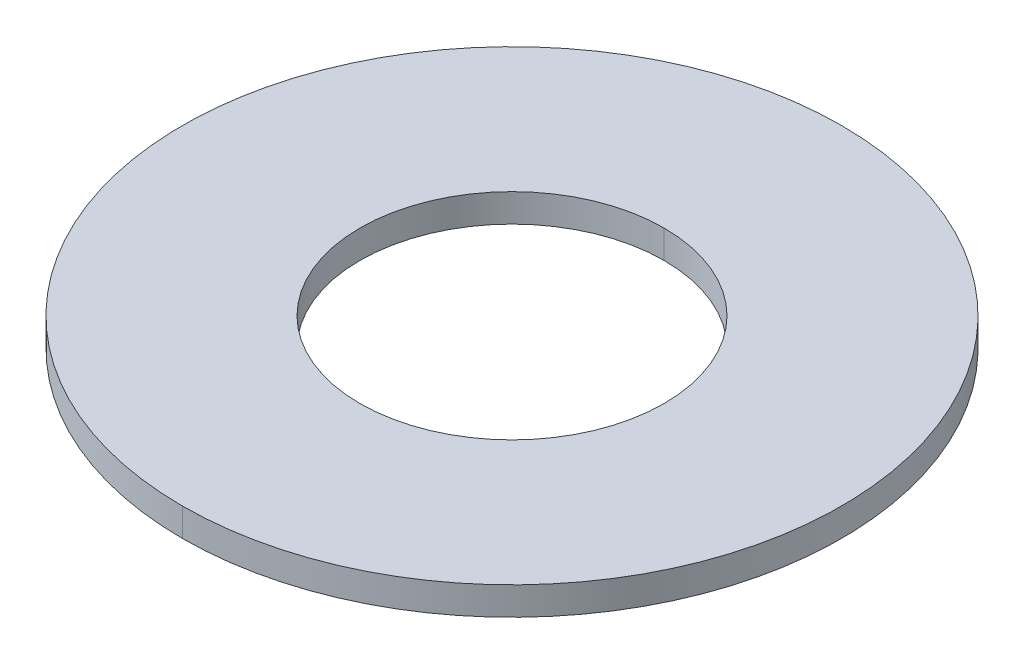
ISO-10303-21;
HEADER;
FILE_DESCRIPTION(('STEP AP214'),'2;1');
FILE_NAME('part.step','',(''),(''),'','','');
FILE_SCHEMA(('AUTOMOTIVE_DESIGN { 1 0 10303 214 1 1 1 1 }'));
ENDSEC;
DATA;
#1=APPLICATION_CONTEXT('core data for automotive mechanical design processes');
#2=APPLICATION_PROTOCOL_DEFINITION('international standard','automotive_design',2000,#1);
#3=PRODUCT_CONTEXT('',#1,'mechanical');
#4=PRODUCT('Part','Part','',(#3));
#5=PRODUCT_RELATED_PRODUCT_CATEGORY('part','',(#4));
#6=PRODUCT_DEFINITION_FORMATION('','',#4);
#7=PRODUCT_DEFINITION_CONTEXT('part definition',#1,'design');
#8=PRODUCT_DEFINITION('design','',#6,#7);
#9=PRODUCT_DEFINITION_SHAPE('','',#8);
#10=(LENGTH_UNIT() NAMED_UNIT(*) SI_UNIT(.MILLI.,.METRE.));
#11=(NAMED_UNIT(*) PLANE_ANGLE_UNIT() SI_UNIT($,.RADIAN.));
#12=(NAMED_UNIT(*) SI_UNIT($,.STERADIAN.) SOLID_ANGLE_UNIT());
#13=UNCERTAINTY_MEASURE_WITH_UNIT(LENGTH_MEASURE(1.E-05),#10,'distance_accuracy_value','');
#14=(GEOMETRIC_REPRESENTATION_CONTEXT(3) GLOBAL_UNCERTAINTY_ASSIGNED_CONTEXT((#13)) GLOBAL_UNIT_ASSIGNED_CONTEXT((#10,
#11,#12)) REPRESENTATION_CONTEXT('',''));
#15=CARTESIAN_POINT('',(0.,0.,0.));
#16=DIRECTION('',(0.,0.,1.));
#17=DIRECTION('',(1.,0.,0.));
#18=AXIS2_PLACEMENT_3D('',#15,#16,#17);
#19=CARTESIAN_POINT('',(0.,0.,0.));
#20=DIRECTION('',(0.,1.,0.));
#21=DIRECTION('',(1.,0.,0.));
#22=AXIS2_PLACEMENT_3D('',#19,#20,#21);
#23=PLANE('',#22);
#24=CARTESIAN_POINT('',(0.,0.,0.));
#25=DIRECTION('',(0.,1.,0.));
#26=DIRECTION('',(0.,0.,1.));
#27=AXIS2_PLACEMENT_3D('',#24,#25,#26);
#28=CIRCLE('',#27,4.7625);
#29=CARTESIAN_POINT('',(0.,0.,-4.7625));
#30=VERTEX_POINT('',#29);
#31=CARTESIAN_POINT('',(0.,0.,4.7625));
#32=VERTEX_POINT('',#31);
#33=EDGE_CURVE('E100',#30,#32,#28,.T.);
#34=ORIENTED_EDGE('',*,*,#33,.F.);
#35=CARTESIAN_POINT('',(0.,0.,0.));
#36=DIRECTION('',(0.,1.,0.));
#37=DIRECTION('',(0.,0.,1.));
#38=AXIS2_PLACEMENT_3D('',#35,#36,#37);
#39=CIRCLE('',#38,4.7625);
#40=EDGE_CURVE('E97',#32,#30,#39,.T.);
#41=ORIENTED_EDGE('',*,*,#40,.F.);
#42=EDGE_LOOP('',(#34,#41));
#43=FACE_BOUND('',#42,.T.);
#44=CARTESIAN_POINT('',(0.,0.,0.));
#45=DIRECTION('',(0.,1.,0.));
#46=DIRECTION('',(0.,0.,1.));
#47=AXIS2_PLACEMENT_3D('',#44,#45,#46);
#48=CIRCLE('',#47,2.1971);
#49=CARTESIAN_POINT('',(0.,0.,-2.1971));
#50=VERTEX_POINT('',#49);
#51=CARTESIAN_POINT('',(0.,0.,2.1971));
#52=VERTEX_POINT('',#51);
#53=EDGE_CURVE('E48',#50,#52,#48,.T.);
#54=ORIENTED_EDGE('',*,*,#53,.T.);
#55=CARTESIAN_POINT('',(0.,0.,0.));
#56=DIRECTION('',(0.,1.,0.));
#57=DIRECTION('',(0.,0.,1.));
#58=AXIS2_PLACEMENT_3D('',#55,#56,#57);
#59=CIRCLE('',#58,2.1971);
#60=EDGE_CURVE('E102',#52,#50,#59,.T.);
#61=ORIENTED_EDGE('',*,*,#60,.T.);
#62=EDGE_LOOP('',(#54,#61));
#63=FACE_BOUND('',#62,.T.);
#64=ADVANCED_FACE('F40',(#43,#63),#23,.F.);
#65=CARTESIAN_POINT('',(0.,0.8128,0.));
#66=DIRECTION('',(0.,-1.,0.));
#67=DIRECTION('',(0.,0.,-1.));
#68=AXIS2_PLACEMENT_3D('',#65,#66,#67);
#69=CYLINDRICAL_SURFACE('',#68,2.1971);
#70=DIRECTION('',(0.,-1.,0.));
#71=VECTOR('',#70,1.);
#72=CARTESIAN_POINT('',(0.,0.8128,-2.1971));
#73=LINE('',#72,#71);
#74=CARTESIAN_POINT('',(0.,0.4064,-2.1971));
#75=VERTEX_POINT('',#74);
#76=EDGE_CURVE('E94',#75,#50,#73,.T.);
#77=ORIENTED_EDGE('',*,*,#76,.F.);
#78=CARTESIAN_POINT('',(0.,0.4064,0.));
#79=DIRECTION('',(0.,-1.,0.));
#80=DIRECTION('',(0.,0.,-1.));
#81=AXIS2_PLACEMENT_3D('',#78,#79,#80);
#82=CIRCLE('',#81,2.1971);
#83=CARTESIAN_POINT('',(0.,0.4064,2.1971));
#84=VERTEX_POINT('',#83);
#85=EDGE_CURVE('E54',#75,#84,#82,.F.);
#86=ORIENTED_EDGE('',*,*,#85,.T.);
#87=DIRECTION('',(0.,-1.,0.));
#88=VECTOR('',#87,1.);
#89=CARTESIAN_POINT('',(0.,0.8128,2.1971));
#90=LINE('',#89,#88);
#91=EDGE_CURVE('E99',#84,#52,#90,.T.);
#92=ORIENTED_EDGE('',*,*,#91,.T.);
#93=ORIENTED_EDGE('',*,*,#53,.F.);
#94=EDGE_LOOP('',(#77,#86,#92,#93));
#95=FACE_BOUND('',#94,.T.);
#96=ADVANCED_FACE('F122',(#95),#69,.F.);
#97=CARTESIAN_POINT('',(0.,0.8128,0.));
#98=DIRECTION('',(0.,-1.,0.));
#99=DIRECTION('',(0.,0.,-1.));
#100=AXIS2_PLACEMENT_3D('',#97,#98,#99);
#101=CYLINDRICAL_SURFACE('',#100,4.7625);
#102=CARTESIAN_POINT('',(0.,0.4064,0.));
#103=DIRECTION('',(0.,-1.,0.));
#104=DIRECTION('',(0.,0.,-1.));
#105=AXIS2_PLACEMENT_3D('',#102,#103,#104);
#106=CIRCLE('',#105,4.7625);
#107=CARTESIAN_POINT('',(0.,0.4064,-4.7625));
#108=VERTEX_POINT('',#107);
#109=CARTESIAN_POINT('',(0.,0.4064,4.7625));
#110=VERTEX_POINT('',#109);
#111=EDGE_CURVE('E88',#108,#110,#106,.F.);
#112=ORIENTED_EDGE('',*,*,#111,.F.);
#113=DIRECTION('',(0.,-1.,0.));
#114=VECTOR('',#113,1.);
#115=CARTESIAN_POINT('',(0.,0.8128,-4.7625));
#116=LINE('',#115,#114);
#117=EDGE_CURVE('E66',#108,#30,#116,.T.);
#118=ORIENTED_EDGE('',*,*,#117,.T.);
#119=ORIENTED_EDGE('',*,*,#33,.T.);
#120=DIRECTION('',(0.,-1.,0.));
#121=VECTOR('',#120,1.);
#122=CARTESIAN_POINT('',(0.,0.8128,4.7625));
#123=LINE('',#122,#121);
#124=EDGE_CURVE('E93',#110,#32,#123,.T.);
#125=ORIENTED_EDGE('',*,*,#124,.F.);
#126=EDGE_LOOP('',(#112,#118,#119,#125));
#127=FACE_BOUND('',#126,.T.);
#128=ADVANCED_FACE('F92',(#127),#101,.T.);
#129=CARTESIAN_POINT('',(0.,0.8128,0.));
#130=DIRECTION('',(0.,-1.,0.));
#131=DIRECTION('',(0.,0.,-1.));
#132=AXIS2_PLACEMENT_3D('',#129,#130,#131);
#133=CYLINDRICAL_SURFACE('',#132,4.7625);
#134=CARTESIAN_POINT('',(0.,0.4064,0.));
#135=DIRECTION('',(0.,-1.,0.));
#136=DIRECTION('',(0.,0.,-1.));
#137=AXIS2_PLACEMENT_3D('',#134,#135,#136);
#138=CIRCLE('',#137,4.7625);
#139=EDGE_CURVE('E86',#110,#108,#138,.F.);
#140=ORIENTED_EDGE('',*,*,#139,.F.);
#141=ORIENTED_EDGE('',*,*,#124,.T.);
#142=ORIENTED_EDGE('',*,*,#40,.T.);
#143=ORIENTED_EDGE('',*,*,#117,.F.);
#144=EDGE_LOOP('',(#140,#141,#142,#143));
#145=FACE_BOUND('',#144,.T.);
#146=ADVANCED_FACE('F42',(#145),#133,.T.);
#147=CARTESIAN_POINT('',(0.,0.8128,0.));
#148=DIRECTION('',(0.,-1.,0.));
#149=DIRECTION('',(0.,0.,-1.));
#150=AXIS2_PLACEMENT_3D('',#147,#148,#149);
#151=CYLINDRICAL_SURFACE('',#150,2.1971);
#152=ORIENTED_EDGE('',*,*,#91,.F.);
#153=CARTESIAN_POINT('',(0.,0.4064,0.));
#154=DIRECTION('',(0.,-1.,0.));
#155=DIRECTION('',(0.,0.,-1.));
#156=AXIS2_PLACEMENT_3D('',#153,#154,#155);
#157=CIRCLE('',#156,2.1971);
#158=EDGE_CURVE('E11',#84,#75,#157,.F.);
#159=ORIENTED_EDGE('',*,*,#158,.T.);
#160=ORIENTED_EDGE('',*,*,#76,.T.);
#161=ORIENTED_EDGE('',*,*,#60,.F.);
#162=EDGE_LOOP('',(#152,#159,#160,#161));
#163=FACE_BOUND('',#162,.T.);
#164=ADVANCED_FACE('F124',(#163),#151,.F.);
#165=CARTESIAN_POINT('',(-4.7625,0.4064,-4.7625));
#166=DIRECTION('',(0.,-1.,0.));
#167=DIRECTION('',(0.,0.,-1.));
#168=AXIS2_PLACEMENT_3D('',#165,#166,#167);
#169=PLANE('',#168);
#170=ORIENTED_EDGE('',*,*,#111,.T.);
#171=ORIENTED_EDGE('',*,*,#139,.T.);
#172=EDGE_LOOP('',(#170,#171));
#173=FACE_BOUND('',#172,.T.);
#174=ORIENTED_EDGE('',*,*,#158,.F.);
#175=ORIENTED_EDGE('',*,*,#85,.F.);
#176=EDGE_LOOP('',(#174,#175));
#177=FACE_BOUND('',#176,.T.);
#178=ADVANCED_FACE('F87',(#173,#177),#169,.F.);
#179=CLOSED_SHELL('',(#64,#96,#128,#146,#164,#178));
#180=MANIFOLD_SOLID_BREP('B2',#179);
#181=ADVANCED_BREP_SHAPE_REPRESENTATION('',(#18,#180),#14);
#182=SHAPE_DEFINITION_REPRESENTATION(#9,#181);
ENDSEC;
END-ISO-10303-21;
